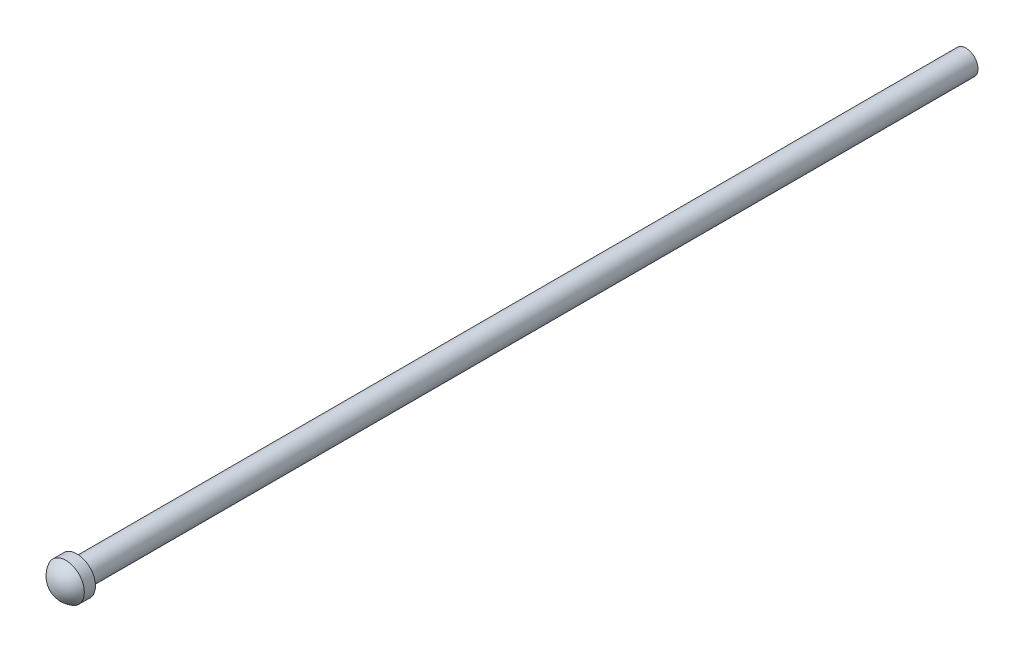
ISO-10303-21;
HEADER;
FILE_DESCRIPTION(('STEP AP214'),'2;1');
FILE_NAME('part.step','',(''),(''),'','','');
FILE_SCHEMA(('AUTOMOTIVE_DESIGN { 1 0 10303 214 1 1 1 1 }'));
ENDSEC;
DATA;
#1=APPLICATION_CONTEXT('core data for automotive mechanical design processes');
#2=APPLICATION_PROTOCOL_DEFINITION('international standard','automotive_design',2000,#1);
#3=PRODUCT_CONTEXT('',#1,'mechanical');
#4=PRODUCT('Part','Part','',(#3));
#5=PRODUCT_RELATED_PRODUCT_CATEGORY('part','',(#4));
#6=PRODUCT_DEFINITION_FORMATION('','',#4);
#7=PRODUCT_DEFINITION_CONTEXT('part definition',#1,'design');
#8=PRODUCT_DEFINITION('design','',#6,#7);
#9=PRODUCT_DEFINITION_SHAPE('','',#8);
#10=(LENGTH_UNIT() NAMED_UNIT(*) SI_UNIT(.MILLI.,.METRE.));
#11=(NAMED_UNIT(*) PLANE_ANGLE_UNIT() SI_UNIT($,.RADIAN.));
#12=(NAMED_UNIT(*) SI_UNIT($,.STERADIAN.) SOLID_ANGLE_UNIT());
#13=UNCERTAINTY_MEASURE_WITH_UNIT(LENGTH_MEASURE(1.E-05),#10,'distance_accuracy_value','');
#14=(GEOMETRIC_REPRESENTATION_CONTEXT(3) GLOBAL_UNCERTAINTY_ASSIGNED_CONTEXT((#13)) GLOBAL_UNIT_ASSIGNED_CONTEXT((#10,
#11,#12)) REPRESENTATION_CONTEXT('',''));
#15=CARTESIAN_POINT('',(0.,0.,0.));
#16=DIRECTION('',(0.,0.,1.));
#17=DIRECTION('',(1.,0.,0.));
#18=AXIS2_PLACEMENT_3D('',#15,#16,#17);
#19=CARTESIAN_POINT('',(5.,60.,-240.));
#20=DIRECTION('',(0.,0.,1.));
#21=DIRECTION('',(1.,0.,0.));
#22=AXIS2_PLACEMENT_3D('',#19,#20,#21);
#23=CYLINDRICAL_SURFACE('',#22,3.25);
#24=CARTESIAN_POINT('',(5.,60.,-240.));
#25=DIRECTION('',(0.,0.,1.));
#26=DIRECTION('',(1.,0.,0.));
#27=AXIS2_PLACEMENT_3D('',#24,#25,#26);
#28=CIRCLE('',#27,3.25);
#29=CARTESIAN_POINT('',(8.25,60.,-240.));
#30=VERTEX_POINT('',#29);
#31=EDGE_CURVE('E10',#30,#30,#28,.T.);
#32=ORIENTED_EDGE('',*,*,#31,.T.);
#33=EDGE_LOOP('',(#32));
#34=FACE_BOUND('',#33,.T.);
#35=CARTESIAN_POINT('',(5.,60.,0.));
#36=DIRECTION('',(0.,0.,1.));
#37=DIRECTION('',(1.,0.,0.));
#38=AXIS2_PLACEMENT_3D('',#35,#36,#37);
#39=CIRCLE('',#38,3.25);
#40=CARTESIAN_POINT('',(8.25,60.,0.));
#41=VERTEX_POINT('',#40);
#42=EDGE_CURVE('E39',#41,#41,#39,.T.);
#43=ORIENTED_EDGE('',*,*,#42,.F.);
#44=EDGE_LOOP('',(#43));
#45=FACE_BOUND('',#44,.T.);
#46=ADVANCED_FACE('F31',(#34,#45),#23,.T.);
#47=CARTESIAN_POINT('',(5.,60.,-240.));
#48=DIRECTION('',(0.,0.,1.));
#49=DIRECTION('',(1.,0.,0.));
#50=AXIS2_PLACEMENT_3D('',#47,#48,#49);
#51=PLANE('',#50);
#52=ORIENTED_EDGE('',*,*,#31,.F.);
#53=EDGE_LOOP('',(#52));
#54=FACE_BOUND('',#53,.T.);
#55=ADVANCED_FACE('F55',(#54),#51,.F.);
#56=CARTESIAN_POINT('',(5.,60.,3.));
#57=DIRECTION('',(0.,0.,-1.));
#58=DIRECTION('',(-1.,0.,0.));
#59=AXIS2_PLACEMENT_3D('',#56,#57,#58);
#60=CYLINDRICAL_SURFACE('',#59,5.);
#61=CARTESIAN_POINT('',(5.,60.,3.));
#62=DIRECTION('',(0.,0.,1.));
#63=DIRECTION('',(1.,0.,0.));
#64=AXIS2_PLACEMENT_3D('',#61,#62,#63);
#65=CIRCLE('',#64,5.);
#66=CARTESIAN_POINT('',(10.,60.,3.));
#67=VERTEX_POINT('',#66);
#68=EDGE_CURVE('E35',#67,#67,#65,.T.);
#69=ORIENTED_EDGE('',*,*,#68,.F.);
#70=EDGE_LOOP('',(#69));
#71=FACE_BOUND('',#70,.T.);
#72=CARTESIAN_POINT('',(5.,60.,0.));
#73=DIRECTION('',(0.,0.,1.));
#74=DIRECTION('',(1.,0.,0.));
#75=AXIS2_PLACEMENT_3D('',#72,#73,#74);
#76=CIRCLE('',#75,5.);
#77=CARTESIAN_POINT('',(10.,60.,0.));
#78=VERTEX_POINT('',#77);
#79=EDGE_CURVE('E45',#78,#78,#76,.T.);
#80=ORIENTED_EDGE('',*,*,#79,.T.);
#81=EDGE_LOOP('',(#80));
#82=FACE_BOUND('',#81,.T.);
#83=ADVANCED_FACE('F53',(#71,#82),#60,.T.);
#84=CARTESIAN_POINT('',(5.,60.,0.333333333333338));
#85=DIRECTION('',(0.,0.,1.));
#86=DIRECTION('',(1.,0.,0.));
#87=AXIS2_PLACEMENT_3D('',#84,#85,#86);
#88=SPHERICAL_SURFACE('',#87,5.66666666666666);
#89=ORIENTED_EDGE('',*,*,#68,.T.);
#90=EDGE_LOOP('',(#89));
#91=FACE_BOUND('',#90,.T.);
#92=ADVANCED_FACE('F33',(#91),#88,.T.);
#93=CARTESIAN_POINT('',(5.,60.,0.));
#94=DIRECTION('',(0.,0.,1.));
#95=DIRECTION('',(1.,0.,0.));
#96=AXIS2_PLACEMENT_3D('',#93,#94,#95);
#97=PLANE('',#96);
#98=ORIENTED_EDGE('',*,*,#42,.T.);
#99=EDGE_LOOP('',(#98));
#100=FACE_BOUND('',#99,.T.);
#101=ORIENTED_EDGE('',*,*,#79,.F.);
#102=EDGE_LOOP('',(#101));
#103=FACE_BOUND('',#102,.T.);
#104=ADVANCED_FACE('F61',(#100,#103),#97,.F.);
#105=CLOSED_SHELL('',(#46,#55,#83,#92,#104));
#106=MANIFOLD_SOLID_BREP('B2',#105);
#107=ADVANCED_BREP_SHAPE_REPRESENTATION('',(#18,#106),#14);
#108=SHAPE_DEFINITION_REPRESENTATION(#9,#107);
ENDSEC;
END-ISO-10303-21;
